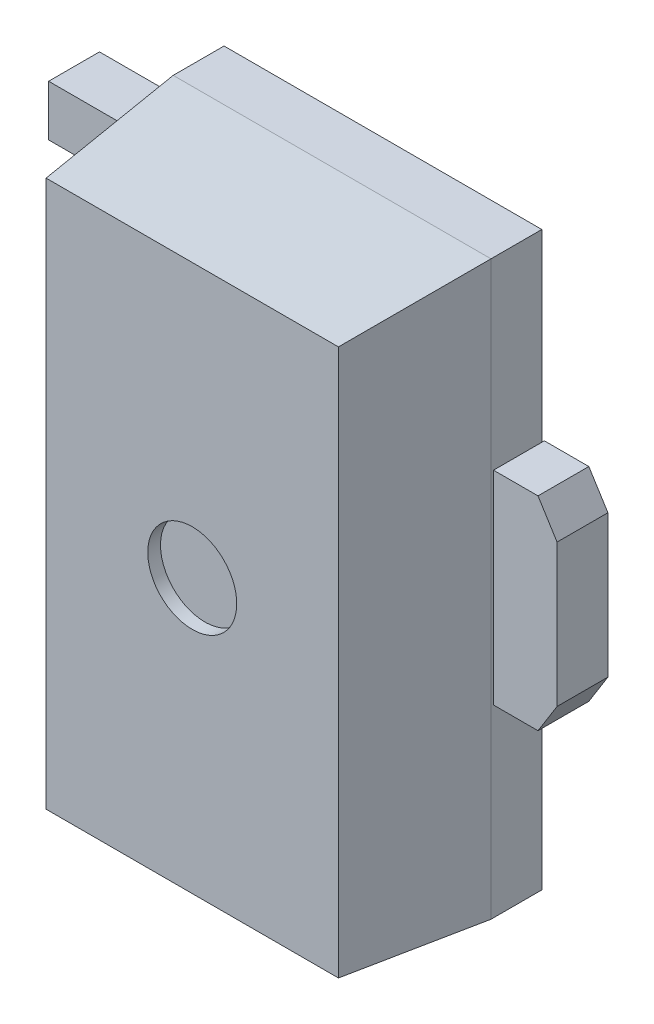
ISO-10303-21;
HEADER;
FILE_DESCRIPTION(('STEP AP214'),'2;1');
FILE_NAME('part.step','',(''),(''),'','','');
FILE_SCHEMA(('AUTOMOTIVE_DESIGN { 1 0 10303 214 1 1 1 1 }'));
ENDSEC;
DATA;
#1=APPLICATION_CONTEXT('core data for automotive mechanical design processes');
#2=APPLICATION_PROTOCOL_DEFINITION('international standard','automotive_design',2000,#1);
#3=PRODUCT_CONTEXT('',#1,'mechanical');
#4=PRODUCT('Part','Part','',(#3));
#5=PRODUCT_RELATED_PRODUCT_CATEGORY('part','',(#4));
#6=PRODUCT_DEFINITION_FORMATION('','',#4);
#7=PRODUCT_DEFINITION_CONTEXT('part definition',#1,'design');
#8=PRODUCT_DEFINITION('design','',#6,#7);
#9=PRODUCT_DEFINITION_SHAPE('','',#8);
#10=(LENGTH_UNIT() NAMED_UNIT(*) SI_UNIT(.MILLI.,.METRE.));
#11=(NAMED_UNIT(*) PLANE_ANGLE_UNIT() SI_UNIT($,.RADIAN.));
#12=(NAMED_UNIT(*) SI_UNIT($,.STERADIAN.) SOLID_ANGLE_UNIT());
#13=UNCERTAINTY_MEASURE_WITH_UNIT(LENGTH_MEASURE(1.E-05),#10,'distance_accuracy_value','');
#14=(GEOMETRIC_REPRESENTATION_CONTEXT(3) GLOBAL_UNCERTAINTY_ASSIGNED_CONTEXT((#13)) GLOBAL_UNIT_ASSIGNED_CONTEXT((#10,
#11,#12)) REPRESENTATION_CONTEXT('',''));
#15=CARTESIAN_POINT('',(0.,0.,0.));
#16=DIRECTION('',(0.,0.,1.));
#17=DIRECTION('',(1.,0.,0.));
#18=AXIS2_PLACEMENT_3D('',#15,#16,#17);
#19=CARTESIAN_POINT('',(-2.25,1.7,0.4));
#20=DIRECTION('',(0.,0.,1.));
#21=DIRECTION('',(1.,0.,0.));
#22=AXIS2_PLACEMENT_3D('',#19,#20,#21);
#23=PLANE('',#22);
#24=DIRECTION('',(0.,-1.,0.));
#25=VECTOR('',#24,1.);
#26=CARTESIAN_POINT('',(-2.25,1.7,0.4));
#27=LINE('',#26,#25);
#28=CARTESIAN_POINT('',(-2.25,1.7,0.4));
#29=VERTEX_POINT('',#28);
#30=CARTESIAN_POINT('',(-2.25,1.3,0.4));
#31=VERTEX_POINT('',#30);
#32=EDGE_CURVE('P0_E10',#29,#31,#27,.T.);
#33=ORIENTED_EDGE('',*,*,#32,.T.);
#34=DIRECTION('',(1.,0.,0.));
#35=VECTOR('',#34,1.);
#36=CARTESIAN_POINT('',(-2.25,1.3,0.4));
#37=LINE('',#36,#35);
#38=CARTESIAN_POINT('',(-0.75,1.3,0.4));
#39=VERTEX_POINT('',#38);
#40=EDGE_CURVE('P0_E27',#31,#39,#37,.T.);
#41=ORIENTED_EDGE('',*,*,#40,.T.);
#42=DIRECTION('',(0.,-1.,0.));
#43=VECTOR('',#42,1.);
#44=CARTESIAN_POINT('',(-0.75,1.7,0.4));
#45=LINE('',#44,#43);
#46=CARTESIAN_POINT('',(-0.75,1.7,0.4));
#47=VERTEX_POINT('',#46);
#48=EDGE_CURVE('P0_E94',#47,#39,#45,.T.);
#49=ORIENTED_EDGE('',*,*,#48,.F.);
#50=DIRECTION('',(1.,0.,0.));
#51=VECTOR('',#50,1.);
#52=CARTESIAN_POINT('',(-2.25,1.7,0.4));
#53=LINE('',#52,#51);
#54=EDGE_CURVE('P0_E52',#29,#47,#53,.T.);
#55=ORIENTED_EDGE('',*,*,#54,.F.);
#56=EDGE_LOOP('',(#33,#41,#49,#55));
#57=FACE_BOUND('',#56,.T.);
#58=ADVANCED_FACE('P0_F16',(#57),#23,.T.);
#59=CARTESIAN_POINT('',(-2.25,1.7,0.));
#60=DIRECTION('',(-1.,0.,0.));
#61=DIRECTION('',(0.,0.,1.));
#62=AXIS2_PLACEMENT_3D('',#59,#60,#61);
#63=PLANE('',#62);
#64=DIRECTION('',(0.,-1.,0.));
#65=VECTOR('',#64,1.);
#66=CARTESIAN_POINT('',(-2.25,1.7,0.));
#67=LINE('',#66,#65);
#68=CARTESIAN_POINT('',(-2.25,1.7,0.));
#69=VERTEX_POINT('',#68);
#70=CARTESIAN_POINT('',(-2.25,1.3,0.));
#71=VERTEX_POINT('',#70);
#72=EDGE_CURVE('P0_E106',#69,#71,#67,.T.);
#73=ORIENTED_EDGE('',*,*,#72,.T.);
#74=DIRECTION('',(0.,0.,1.));
#75=VECTOR('',#74,1.);
#76=CARTESIAN_POINT('',(-2.25,1.3,0.));
#77=LINE('',#76,#75);
#78=EDGE_CURVE('P0_E65',#71,#31,#77,.T.);
#79=ORIENTED_EDGE('',*,*,#78,.T.);
#80=ORIENTED_EDGE('',*,*,#32,.F.);
#81=DIRECTION('',(0.,0.,1.));
#82=VECTOR('',#81,1.);
#83=CARTESIAN_POINT('',(-2.25,1.7,0.));
#84=LINE('',#83,#82);
#85=EDGE_CURVE('P0_E91',#69,#29,#84,.T.);
#86=ORIENTED_EDGE('',*,*,#85,.F.);
#87=EDGE_LOOP('',(#73,#79,#80,#86));
#88=FACE_BOUND('',#87,.T.);
#89=ADVANCED_FACE('P0_F121',(#88),#63,.T.);
#90=CARTESIAN_POINT('',(-0.75,1.7,0.4));
#91=DIRECTION('',(1.,0.,0.));
#92=DIRECTION('',(0.,1.,0.));
#93=AXIS2_PLACEMENT_3D('',#90,#91,#92);
#94=PLANE('',#93);
#95=ORIENTED_EDGE('',*,*,#48,.T.);
#96=DIRECTION('',(0.,0.,-1.));
#97=VECTOR('',#96,1.);
#98=CARTESIAN_POINT('',(-0.75,1.3,0.4));
#99=LINE('',#98,#97);
#100=CARTESIAN_POINT('',(-0.75,1.3,0.));
#101=VERTEX_POINT('',#100);
#102=EDGE_CURVE('P0_E93',#39,#101,#99,.T.);
#103=ORIENTED_EDGE('',*,*,#102,.T.);
#104=DIRECTION('',(0.,-1.,0.));
#105=VECTOR('',#104,1.);
#106=CARTESIAN_POINT('',(-0.75,1.7,0.));
#107=LINE('',#106,#105);
#108=CARTESIAN_POINT('',(-0.75,1.7,0.));
#109=VERTEX_POINT('',#108);
#110=EDGE_CURVE('P0_E82',#109,#101,#107,.T.);
#111=ORIENTED_EDGE('',*,*,#110,.F.);
#112=DIRECTION('',(0.,0.,-1.));
#113=VECTOR('',#112,1.);
#114=CARTESIAN_POINT('',(-0.75,1.7,0.4));
#115=LINE('',#114,#113);
#116=EDGE_CURVE('P0_E113',#47,#109,#115,.T.);
#117=ORIENTED_EDGE('',*,*,#116,.F.);
#118=EDGE_LOOP('',(#95,#103,#111,#117));
#119=FACE_BOUND('',#118,.T.);
#120=ADVANCED_FACE('P0_F18',(#119),#94,.T.);
#121=CARTESIAN_POINT('',(-1.5,1.7,0.2));
#122=DIRECTION('',(0.,1.,0.));
#123=DIRECTION('',(1.,0.,0.));
#124=AXIS2_PLACEMENT_3D('',#121,#122,#123);
#125=PLANE('',#124);
#126=ORIENTED_EDGE('',*,*,#54,.T.);
#127=ORIENTED_EDGE('',*,*,#116,.T.);
#128=DIRECTION('',(-1.,0.,0.));
#129=VECTOR('',#128,1.);
#130=CARTESIAN_POINT('',(-0.75,1.7,0.));
#131=LINE('',#130,#129);
#132=EDGE_CURVE('P0_E20',#109,#69,#131,.T.);
#133=ORIENTED_EDGE('',*,*,#132,.T.);
#134=ORIENTED_EDGE('',*,*,#85,.T.);
#135=EDGE_LOOP('',(#126,#127,#133,#134));
#136=FACE_BOUND('',#135,.T.);
#137=ADVANCED_FACE('P0_F122',(#136),#125,.T.);
#138=CARTESIAN_POINT('',(-1.5,1.3,0.2));
#139=DIRECTION('',(0.,1.,0.));
#140=DIRECTION('',(1.,0.,0.));
#141=AXIS2_PLACEMENT_3D('',#138,#139,#140);
#142=PLANE('',#141);
#143=ORIENTED_EDGE('',*,*,#78,.F.);
#144=DIRECTION('',(-1.,0.,0.));
#145=VECTOR('',#144,1.);
#146=CARTESIAN_POINT('',(-0.75,1.3,0.));
#147=LINE('',#146,#145);
#148=EDGE_CURVE('P0_E86',#101,#71,#147,.T.);
#149=ORIENTED_EDGE('',*,*,#148,.F.);
#150=ORIENTED_EDGE('',*,*,#102,.F.);
#151=ORIENTED_EDGE('',*,*,#40,.F.);
#152=EDGE_LOOP('',(#143,#149,#150,#151));
#153=FACE_BOUND('',#152,.T.);
#154=ADVANCED_FACE('P0_F97',(#153),#142,.F.);
#155=CARTESIAN_POINT('',(-0.75,1.7,0.));
#156=DIRECTION('',(0.,0.,-1.));
#157=DIRECTION('',(-1.,0.,0.));
#158=AXIS2_PLACEMENT_3D('',#155,#156,#157);
#159=PLANE('',#158);
#160=ORIENTED_EDGE('',*,*,#110,.T.);
#161=ORIENTED_EDGE('',*,*,#148,.T.);
#162=ORIENTED_EDGE('',*,*,#72,.F.);
#163=ORIENTED_EDGE('',*,*,#132,.F.);
#164=EDGE_LOOP('',(#160,#161,#162,#163));
#165=FACE_BOUND('',#164,.T.);
#166=ADVANCED_FACE('P0_F84',(#165),#159,.T.);
#167=CLOSED_SHELL('',(#58,#89,#120,#137,#154,#166));
#168=MANIFOLD_SOLID_BREP('P0_B1',#167);
#169=CARTESIAN_POINT('',(-2.25,0.2,0.4));
#170=DIRECTION('',(0.,0.,1.));
#171=DIRECTION('',(1.,0.,0.));
#172=AXIS2_PLACEMENT_3D('',#169,#170,#171);
#173=PLANE('',#172);
#174=DIRECTION('',(0.,-1.,0.));
#175=VECTOR('',#174,1.);
#176=CARTESIAN_POINT('',(-2.25,0.2,0.4));
#177=LINE('',#176,#175);
#178=CARTESIAN_POINT('',(-2.25,0.2,0.4));
#179=VERTEX_POINT('',#178);
#180=CARTESIAN_POINT('',(-2.25,-0.2,0.4));
#181=VERTEX_POINT('',#180);
#182=EDGE_CURVE('P1_E11',#179,#181,#177,.T.);
#183=ORIENTED_EDGE('',*,*,#182,.T.);
#184=DIRECTION('',(1.,0.,0.));
#185=VECTOR('',#184,1.);
#186=CARTESIAN_POINT('',(-2.25,-0.2,0.4));
#187=LINE('',#186,#185);
#188=CARTESIAN_POINT('',(-0.75,-0.2,0.4));
#189=VERTEX_POINT('',#188);
#190=EDGE_CURVE('P1_E28',#181,#189,#187,.T.);
#191=ORIENTED_EDGE('',*,*,#190,.T.);
#192=DIRECTION('',(0.,-1.,0.));
#193=VECTOR('',#192,1.);
#194=CARTESIAN_POINT('',(-0.75,0.2,0.4));
#195=LINE('',#194,#193);
#196=CARTESIAN_POINT('',(-0.75,0.2,0.4));
#197=VERTEX_POINT('',#196);
#198=EDGE_CURVE('P1_E103',#197,#189,#195,.T.);
#199=ORIENTED_EDGE('',*,*,#198,.F.);
#200=DIRECTION('',(1.,0.,0.));
#201=VECTOR('',#200,1.);
#202=CARTESIAN_POINT('',(-2.25,0.2,0.4));
#203=LINE('',#202,#201);
#204=EDGE_CURVE('P1_E82',#179,#197,#203,.T.);
#205=ORIENTED_EDGE('',*,*,#204,.F.);
#206=EDGE_LOOP('',(#183,#191,#199,#205));
#207=FACE_BOUND('',#206,.T.);
#208=ADVANCED_FACE('P1_F17',(#207),#173,.T.);
#209=CARTESIAN_POINT('',(-0.75,0.2,0.4));
#210=DIRECTION('',(1.,0.,0.));
#211=DIRECTION('',(0.,1.,0.));
#212=AXIS2_PLACEMENT_3D('',#209,#210,#211);
#213=PLANE('',#212);
#214=ORIENTED_EDGE('',*,*,#198,.T.);
#215=DIRECTION('',(0.,0.,-1.));
#216=VECTOR('',#215,1.);
#217=CARTESIAN_POINT('',(-0.75,-0.2,0.4));
#218=LINE('',#217,#216);
#219=CARTESIAN_POINT('',(-0.75,-0.2,0.));
#220=VERTEX_POINT('',#219);
#221=EDGE_CURVE('P1_E88',#189,#220,#218,.T.);
#222=ORIENTED_EDGE('',*,*,#221,.T.);
#223=DIRECTION('',(0.,-1.,0.));
#224=VECTOR('',#223,1.);
#225=CARTESIAN_POINT('',(-0.75,0.2,0.));
#226=LINE('',#225,#224);
#227=CARTESIAN_POINT('',(-0.75,0.2,0.));
#228=VERTEX_POINT('',#227);
#229=EDGE_CURVE('P1_E21',#228,#220,#226,.T.);
#230=ORIENTED_EDGE('',*,*,#229,.F.);
#231=DIRECTION('',(0.,0.,-1.));
#232=VECTOR('',#231,1.);
#233=CARTESIAN_POINT('',(-0.75,0.2,0.4));
#234=LINE('',#233,#232);
#235=EDGE_CURVE('P1_E76',#197,#228,#234,.T.);
#236=ORIENTED_EDGE('',*,*,#235,.F.);
#237=EDGE_LOOP('',(#214,#222,#230,#236));
#238=FACE_BOUND('',#237,.T.);
#239=ADVANCED_FACE('P1_F87',(#238),#213,.T.);
#240=CARTESIAN_POINT('',(-0.75,0.2,0.));
#241=DIRECTION('',(0.,0.,-1.));
#242=DIRECTION('',(-1.,0.,0.));
#243=AXIS2_PLACEMENT_3D('',#240,#241,#242);
#244=PLANE('',#243);
#245=ORIENTED_EDGE('',*,*,#229,.T.);
#246=DIRECTION('',(-1.,0.,0.));
#247=VECTOR('',#246,1.);
#248=CARTESIAN_POINT('',(-0.75,-0.2,0.));
#249=LINE('',#248,#247);
#250=CARTESIAN_POINT('',(-2.25,-0.2,0.));
#251=VERTEX_POINT('',#250);
#252=EDGE_CURVE('P1_E92',#220,#251,#249,.T.);
#253=ORIENTED_EDGE('',*,*,#252,.T.);
#254=DIRECTION('',(0.,-1.,0.));
#255=VECTOR('',#254,1.);
#256=CARTESIAN_POINT('',(-2.25,0.2,0.));
#257=LINE('',#256,#255);
#258=CARTESIAN_POINT('',(-2.25,0.2,0.));
#259=VERTEX_POINT('',#258);
#260=EDGE_CURVE('P1_E69',#259,#251,#257,.T.);
#261=ORIENTED_EDGE('',*,*,#260,.F.);
#262=DIRECTION('',(-1.,0.,0.));
#263=VECTOR('',#262,1.);
#264=CARTESIAN_POINT('',(-0.75,0.2,0.));
#265=LINE('',#264,#263);
#266=EDGE_CURVE('P1_E81',#228,#259,#265,.T.);
#267=ORIENTED_EDGE('',*,*,#266,.F.);
#268=EDGE_LOOP('',(#245,#253,#261,#267));
#269=FACE_BOUND('',#268,.T.);
#270=ADVANCED_FACE('P1_F19',(#269),#244,.T.);
#271=CARTESIAN_POINT('',(-2.25,0.2,0.));
#272=DIRECTION('',(-1.,0.,0.));
#273=DIRECTION('',(0.,0.,1.));
#274=AXIS2_PLACEMENT_3D('',#271,#272,#273);
#275=PLANE('',#274);
#276=ORIENTED_EDGE('',*,*,#260,.T.);
#277=DIRECTION('',(0.,0.,1.));
#278=VECTOR('',#277,1.);
#279=CARTESIAN_POINT('',(-2.25,-0.2,0.));
#280=LINE('',#279,#278);
#281=EDGE_CURVE('P1_E107',#251,#181,#280,.T.);
#282=ORIENTED_EDGE('',*,*,#281,.T.);
#283=ORIENTED_EDGE('',*,*,#182,.F.);
#284=DIRECTION('',(0.,0.,1.));
#285=VECTOR('',#284,1.);
#286=CARTESIAN_POINT('',(-2.25,0.2,0.));
#287=LINE('',#286,#285);
#288=EDGE_CURVE('P1_E94',#259,#179,#287,.T.);
#289=ORIENTED_EDGE('',*,*,#288,.F.);
#290=EDGE_LOOP('',(#276,#282,#283,#289));
#291=FACE_BOUND('',#290,.T.);
#292=ADVANCED_FACE('P1_F120',(#291),#275,.T.);
#293=CARTESIAN_POINT('',(-1.5,0.2,0.2));
#294=DIRECTION('',(0.,1.,0.));
#295=DIRECTION('',(1.,0.,0.));
#296=AXIS2_PLACEMENT_3D('',#293,#294,#295);
#297=PLANE('',#296);
#298=ORIENTED_EDGE('',*,*,#204,.T.);
#299=ORIENTED_EDGE('',*,*,#235,.T.);
#300=ORIENTED_EDGE('',*,*,#266,.T.);
#301=ORIENTED_EDGE('',*,*,#288,.T.);
#302=EDGE_LOOP('',(#298,#299,#300,#301));
#303=FACE_BOUND('',#302,.T.);
#304=ADVANCED_FACE('P1_F78',(#303),#297,.T.);
#305=CARTESIAN_POINT('',(-1.5,-0.2,0.2));
#306=DIRECTION('',(0.,1.,0.));
#307=DIRECTION('',(1.,0.,0.));
#308=AXIS2_PLACEMENT_3D('',#305,#306,#307);
#309=PLANE('',#308);
#310=ORIENTED_EDGE('',*,*,#281,.F.);
#311=ORIENTED_EDGE('',*,*,#252,.F.);
#312=ORIENTED_EDGE('',*,*,#221,.F.);
#313=ORIENTED_EDGE('',*,*,#190,.F.);
#314=EDGE_LOOP('',(#310,#311,#312,#313));
#315=FACE_BOUND('',#314,.T.);
#316=ADVANCED_FACE('P1_F128',(#315),#309,.F.);
#317=CLOSED_SHELL('',(#208,#239,#270,#292,#304,#316));
#318=MANIFOLD_SOLID_BREP('P1_B1',#317);
#319=CARTESIAN_POINT('',(-2.25,-1.3,0.4));
#320=DIRECTION('',(0.,0.,1.));
#321=DIRECTION('',(1.,0.,0.));
#322=AXIS2_PLACEMENT_3D('',#319,#320,#321);
#323=PLANE('',#322);
#324=DIRECTION('',(0.,-1.,0.));
#325=VECTOR('',#324,1.);
#326=CARTESIAN_POINT('',(-2.25,-1.3,0.4));
#327=LINE('',#326,#325);
#328=CARTESIAN_POINT('',(-2.25,-1.3,0.4));
#329=VERTEX_POINT('',#328);
#330=CARTESIAN_POINT('',(-2.25,-1.7,0.4));
#331=VERTEX_POINT('',#330);
#332=EDGE_CURVE('P2_E11',#329,#331,#327,.T.);
#333=ORIENTED_EDGE('',*,*,#332,.T.);
#334=DIRECTION('',(1.,0.,0.));
#335=VECTOR('',#334,1.);
#336=CARTESIAN_POINT('',(-2.25,-1.7,0.4));
#337=LINE('',#336,#335);
#338=CARTESIAN_POINT('',(-0.75,-1.7,0.4));
#339=VERTEX_POINT('',#338);
#340=EDGE_CURVE('P2_E28',#331,#339,#337,.T.);
#341=ORIENTED_EDGE('',*,*,#340,.T.);
#342=DIRECTION('',(0.,-1.,0.));
#343=VECTOR('',#342,1.);
#344=CARTESIAN_POINT('',(-0.75,-1.3,0.4));
#345=LINE('',#344,#343);
#346=CARTESIAN_POINT('',(-0.75,-1.3,0.4));
#347=VERTEX_POINT('',#346);
#348=EDGE_CURVE('P2_E88',#347,#339,#345,.T.);
#349=ORIENTED_EDGE('',*,*,#348,.F.);
#350=DIRECTION('',(1.,0.,0.));
#351=VECTOR('',#350,1.);
#352=CARTESIAN_POINT('',(-2.25,-1.3,0.4));
#353=LINE('',#352,#351);
#354=EDGE_CURVE('P2_E104',#329,#347,#353,.T.);
#355=ORIENTED_EDGE('',*,*,#354,.F.);
#356=EDGE_LOOP('',(#333,#341,#349,#355));
#357=FACE_BOUND('',#356,.T.);
#358=ADVANCED_FACE('P2_F17',(#357),#323,.T.);
#359=CARTESIAN_POINT('',(-0.75,-1.3,0.4));
#360=DIRECTION('',(1.,0.,0.));
#361=DIRECTION('',(0.,1.,0.));
#362=AXIS2_PLACEMENT_3D('',#359,#360,#361);
#363=PLANE('',#362);
#364=ORIENTED_EDGE('',*,*,#348,.T.);
#365=DIRECTION('',(0.,0.,-1.));
#366=VECTOR('',#365,1.);
#367=CARTESIAN_POINT('',(-0.75,-1.7,0.4));
#368=LINE('',#367,#366);
#369=CARTESIAN_POINT('',(-0.75,-1.7,0.));
#370=VERTEX_POINT('',#369);
#371=EDGE_CURVE('P2_E84',#339,#370,#368,.T.);
#372=ORIENTED_EDGE('',*,*,#371,.T.);
#373=DIRECTION('',(0.,-1.,0.));
#374=VECTOR('',#373,1.);
#375=CARTESIAN_POINT('',(-0.75,-1.3,0.));
#376=LINE('',#375,#374);
#377=CARTESIAN_POINT('',(-0.75,-1.3,0.));
#378=VERTEX_POINT('',#377);
#379=EDGE_CURVE('P2_E75',#378,#370,#376,.T.);
#380=ORIENTED_EDGE('',*,*,#379,.F.);
#381=DIRECTION('',(0.,0.,-1.));
#382=VECTOR('',#381,1.);
#383=CARTESIAN_POINT('',(-0.75,-1.3,0.4));
#384=LINE('',#383,#382);
#385=EDGE_CURVE('P2_E67',#347,#378,#384,.T.);
#386=ORIENTED_EDGE('',*,*,#385,.F.);
#387=EDGE_LOOP('',(#364,#372,#380,#386));
#388=FACE_BOUND('',#387,.T.);
#389=ADVANCED_FACE('P2_F86',(#388),#363,.T.);
#390=CARTESIAN_POINT('',(-0.75,-1.3,0.));
#391=DIRECTION('',(0.,0.,-1.));
#392=DIRECTION('',(-1.,0.,0.));
#393=AXIS2_PLACEMENT_3D('',#390,#391,#392);
#394=PLANE('',#393);
#395=ORIENTED_EDGE('',*,*,#379,.T.);
#396=DIRECTION('',(-1.,0.,0.));
#397=VECTOR('',#396,1.);
#398=CARTESIAN_POINT('',(-0.75,-1.7,0.));
#399=LINE('',#398,#397);
#400=CARTESIAN_POINT('',(-2.25,-1.7,0.));
#401=VERTEX_POINT('',#400);
#402=EDGE_CURVE('P2_E80',#370,#401,#399,.T.);
#403=ORIENTED_EDGE('',*,*,#402,.T.);
#404=DIRECTION('',(0.,-1.,0.));
#405=VECTOR('',#404,1.);
#406=CARTESIAN_POINT('',(-2.25,-1.3,0.));
#407=LINE('',#406,#405);
#408=CARTESIAN_POINT('',(-2.25,-1.3,0.));
#409=VERTEX_POINT('',#408);
#410=EDGE_CURVE('P2_E94',#409,#401,#407,.T.);
#411=ORIENTED_EDGE('',*,*,#410,.F.);
#412=DIRECTION('',(-1.,0.,0.));
#413=VECTOR('',#412,1.);
#414=CARTESIAN_POINT('',(-0.75,-1.3,0.));
#415=LINE('',#414,#413);
#416=EDGE_CURVE('P2_E81',#378,#409,#415,.T.);
#417=ORIENTED_EDGE('',*,*,#416,.F.);
#418=EDGE_LOOP('',(#395,#403,#411,#417));
#419=FACE_BOUND('',#418,.T.);
#420=ADVANCED_FACE('P2_F77',(#419),#394,.T.);
#421=CARTESIAN_POINT('',(-2.25,-1.3,0.));
#422=DIRECTION('',(-1.,0.,0.));
#423=DIRECTION('',(0.,0.,1.));
#424=AXIS2_PLACEMENT_3D('',#421,#422,#423);
#425=PLANE('',#424);
#426=ORIENTED_EDGE('',*,*,#410,.T.);
#427=DIRECTION('',(0.,0.,1.));
#428=VECTOR('',#427,1.);
#429=CARTESIAN_POINT('',(-2.25,-1.7,0.));
#430=LINE('',#429,#428);
#431=EDGE_CURVE('P2_E21',#401,#331,#430,.T.);
#432=ORIENTED_EDGE('',*,*,#431,.T.);
#433=ORIENTED_EDGE('',*,*,#332,.F.);
#434=DIRECTION('',(0.,0.,1.));
#435=VECTOR('',#434,1.);
#436=CARTESIAN_POINT('',(-2.25,-1.3,0.));
#437=LINE('',#436,#435);
#438=EDGE_CURVE('P2_E106',#409,#329,#437,.T.);
#439=ORIENTED_EDGE('',*,*,#438,.F.);
#440=EDGE_LOOP('',(#426,#432,#433,#439));
#441=FACE_BOUND('',#440,.T.);
#442=ADVANCED_FACE('P2_F19',(#441),#425,.T.);
#443=CARTESIAN_POINT('',(-1.5,-1.3,0.2));
#444=DIRECTION('',(0.,1.,0.));
#445=DIRECTION('',(1.,0.,0.));
#446=AXIS2_PLACEMENT_3D('',#443,#444,#445);
#447=PLANE('',#446);
#448=ORIENTED_EDGE('',*,*,#354,.T.);
#449=ORIENTED_EDGE('',*,*,#385,.T.);
#450=ORIENTED_EDGE('',*,*,#416,.T.);
#451=ORIENTED_EDGE('',*,*,#438,.T.);
#452=EDGE_LOOP('',(#448,#449,#450,#451));
#453=FACE_BOUND('',#452,.T.);
#454=ADVANCED_FACE('P2_F158',(#453),#447,.T.);
#455=CARTESIAN_POINT('',(-1.5,-1.7,0.2));
#456=DIRECTION('',(0.,1.,0.));
#457=DIRECTION('',(1.,0.,0.));
#458=AXIS2_PLACEMENT_3D('',#455,#456,#457);
#459=PLANE('',#458);
#460=ORIENTED_EDGE('',*,*,#431,.F.);
#461=ORIENTED_EDGE('',*,*,#402,.F.);
#462=ORIENTED_EDGE('',*,*,#371,.F.);
#463=ORIENTED_EDGE('',*,*,#340,.F.);
#464=EDGE_LOOP('',(#460,#461,#462,#463));
#465=FACE_BOUND('',#464,.T.);
#466=ADVANCED_FACE('P2_F91',(#465),#459,.F.);
#467=CLOSED_SHELL('',(#358,#389,#420,#442,#454,#466));
#468=MANIFOLD_SOLID_BREP('P2_B1',#467);
#469=CARTESIAN_POINT('',(1.75,0.,0.));
#470=DIRECTION('',(1.,0.,0.));
#471=DIRECTION('',(0.,1.,0.));
#472=AXIS2_PLACEMENT_3D('',#469,#470,#471);
#473=PLANE('',#472);
#474=DIRECTION('',(0.,0.,1.));
#475=VECTOR('',#474,1.);
#476=CARTESIAN_POINT('',(1.75,-0.56,0.));
#477=LINE('',#476,#475);
#478=CARTESIAN_POINT('',(1.75,-0.56,0.));
#479=VERTEX_POINT('',#478);
#480=CARTESIAN_POINT('',(1.75,-0.56,0.4));
#481=VERTEX_POINT('',#480);
#482=EDGE_CURVE('P3_E37',#479,#481,#477,.T.);
#483=ORIENTED_EDGE('',*,*,#482,.F.);
#484=DIRECTION('',(0.,1.,0.));
#485=VECTOR('',#484,1.);
#486=CARTESIAN_POINT('',(1.75,-0.56,0.));
#487=LINE('',#486,#485);
#488=CARTESIAN_POINT('',(1.75,0.56,0.));
#489=VERTEX_POINT('',#488);
#490=EDGE_CURVE('P3_E11',#479,#489,#487,.T.);
#491=ORIENTED_EDGE('',*,*,#490,.T.);
#492=DIRECTION('',(0.,0.,1.));
#493=VECTOR('',#492,1.);
#494=CARTESIAN_POINT('',(1.75,0.56,0.));
#495=LINE('',#494,#493);
#496=CARTESIAN_POINT('',(1.75,0.56,0.4));
#497=VERTEX_POINT('',#496);
#498=EDGE_CURVE('P3_E26',#489,#497,#495,.T.);
#499=ORIENTED_EDGE('',*,*,#498,.T.);
#500=DIRECTION('',(0.,-1.,0.));
#501=VECTOR('',#500,1.);
#502=CARTESIAN_POINT('',(1.75,0.56,0.4));
#503=LINE('',#502,#501);
#504=EDGE_CURVE('P3_E146',#497,#481,#503,.T.);
#505=ORIENTED_EDGE('',*,*,#504,.T.);
#506=EDGE_LOOP('',(#483,#491,#499,#505));
#507=FACE_BOUND('',#506,.T.);
#508=ADVANCED_FACE('P3_F17',(#507),#473,.T.);
#509=CARTESIAN_POINT('',(1.75,-0.56,0.));
#510=DIRECTION('',(0.847998304005144,-0.52999894000309,0.));
#511=DIRECTION('',(0.,0.,-1.));
#512=AXIS2_PLACEMENT_3D('',#509,#510,#511);
#513=PLANE('',#512);
#514=ORIENTED_EDGE('',*,*,#482,.T.);
#515=DIRECTION('',(-0.52999894000309,-0.847998304005144,0.));
#516=VECTOR('',#515,1.);
#517=CARTESIAN_POINT('',(1.75,-0.56,0.4));
#518=LINE('',#517,#516);
#519=CARTESIAN_POINT('',(1.6,-0.8,0.4));
#520=VERTEX_POINT('',#519);
#521=EDGE_CURVE('P3_E143',#481,#520,#518,.T.);
#522=ORIENTED_EDGE('',*,*,#521,.T.);
#523=DIRECTION('',(0.,0.,1.));
#524=VECTOR('',#523,1.);
#525=CARTESIAN_POINT('',(1.6,-0.8,0.));
#526=LINE('',#525,#524);
#527=CARTESIAN_POINT('',(1.6,-0.8,0.));
#528=VERTEX_POINT('',#527);
#529=EDGE_CURVE('P3_E136',#528,#520,#526,.T.);
#530=ORIENTED_EDGE('',*,*,#529,.F.);
#531=DIRECTION('',(-0.52999894000309,-0.847998304005144,0.));
#532=VECTOR('',#531,1.);
#533=CARTESIAN_POINT('',(1.75,-0.56,0.));
#534=LINE('',#533,#532);
#535=EDGE_CURVE('P3_E129',#479,#528,#534,.T.);
#536=ORIENTED_EDGE('',*,*,#535,.F.);
#537=EDGE_LOOP('',(#514,#522,#530,#536));
#538=FACE_BOUND('',#537,.T.);
#539=ADVANCED_FACE('P3_F141',(#538),#513,.T.);
#540=CARTESIAN_POINT('',(1.6,-0.8,0.));
#541=DIRECTION('',(0.,-1.,0.));
#542=DIRECTION('',(0.,0.,-1.));
#543=AXIS2_PLACEMENT_3D('',#540,#541,#542);
#544=PLANE('',#543);
#545=ORIENTED_EDGE('',*,*,#529,.T.);
#546=DIRECTION('',(-1.,0.,0.));
#547=VECTOR('',#546,1.);
#548=CARTESIAN_POINT('',(1.6,-0.8,0.4));
#549=LINE('',#548,#547);
#550=CARTESIAN_POINT('',(1.25,-0.8,0.4));
#551=VERTEX_POINT('',#550);
#552=EDGE_CURVE('P3_E154',#520,#551,#549,.T.);
#553=ORIENTED_EDGE('',*,*,#552,.T.);
#554=DIRECTION('',(0.,0.,1.));
#555=VECTOR('',#554,1.);
#556=CARTESIAN_POINT('',(1.25,-0.8,0.));
#557=LINE('',#556,#555);
#558=CARTESIAN_POINT('',(1.25,-0.8,0.));
#559=VERTEX_POINT('',#558);
#560=EDGE_CURVE('P3_E203',#559,#551,#557,.T.);
#561=ORIENTED_EDGE('',*,*,#560,.F.);
#562=DIRECTION('',(-1.,0.,0.));
#563=VECTOR('',#562,1.);
#564=CARTESIAN_POINT('',(1.6,-0.8,0.));
#565=LINE('',#564,#563);
#566=EDGE_CURVE('P3_E178',#528,#559,#565,.T.);
#567=ORIENTED_EDGE('',*,*,#566,.F.);
#568=EDGE_LOOP('',(#545,#553,#561,#567));
#569=FACE_BOUND('',#568,.T.);
#570=ADVANCED_FACE('P3_F362',(#569),#544,.T.);
#571=CARTESIAN_POINT('',(1.25,-0.8,0.));
#572=DIRECTION('',(-1.,0.,0.));
#573=DIRECTION('',(0.,0.,1.));
#574=AXIS2_PLACEMENT_3D('',#571,#572,#573);
#575=PLANE('',#574);
#576=ORIENTED_EDGE('',*,*,#560,.T.);
#577=DIRECTION('',(0.,1.,0.));
#578=VECTOR('',#577,1.);
#579=CARTESIAN_POINT('',(1.25,-0.8,0.4));
#580=LINE('',#579,#578);
#581=CARTESIAN_POINT('',(1.25,-0.64,0.4));
#582=VERTEX_POINT('',#581);
#583=EDGE_CURVE('P3_E205',#551,#582,#580,.T.);
#584=ORIENTED_EDGE('',*,*,#583,.T.);
#585=DIRECTION('',(0.,0.,1.));
#586=VECTOR('',#585,1.);
#587=CARTESIAN_POINT('',(1.25,-0.64,0.));
#588=LINE('',#587,#586);
#589=CARTESIAN_POINT('',(1.25,-0.64,0.));
#590=VERTEX_POINT('',#589);
#591=EDGE_CURVE('P3_E174',#590,#582,#588,.T.);
#592=ORIENTED_EDGE('',*,*,#591,.F.);
#593=DIRECTION('',(0.,1.,0.));
#594=VECTOR('',#593,1.);
#595=CARTESIAN_POINT('',(1.25,-0.8,0.));
#596=LINE('',#595,#594);
#597=EDGE_CURVE('P3_E221',#559,#590,#596,.T.);
#598=ORIENTED_EDGE('',*,*,#597,.F.);
#599=EDGE_LOOP('',(#576,#584,#592,#598));
#600=FACE_BOUND('',#599,.T.);
#601=ADVANCED_FACE('P3_F367',(#600),#575,.T.);
#602=CARTESIAN_POINT('',(1.25,-0.64,0.));
#603=DIRECTION('',(0.,-1.,0.));
#604=DIRECTION('',(0.,0.,-1.));
#605=AXIS2_PLACEMENT_3D('',#602,#603,#604);
#606=PLANE('',#605);
#607=ORIENTED_EDGE('',*,*,#591,.T.);
#608=DIRECTION('',(-1.,0.,0.));
#609=VECTOR('',#608,1.);
#610=CARTESIAN_POINT('',(1.25,-0.64,0.4));
#611=LINE('',#610,#609);
#612=CARTESIAN_POINT('',(-0.75,-0.64,0.4));
#613=VERTEX_POINT('',#612);
#614=EDGE_CURVE('P3_E170',#582,#613,#611,.T.);
#615=ORIENTED_EDGE('',*,*,#614,.T.);
#616=DIRECTION('',(0.,0.,1.));
#617=VECTOR('',#616,1.);
#618=CARTESIAN_POINT('',(-0.75,-0.64,0.));
#619=LINE('',#618,#617);
#620=CARTESIAN_POINT('',(-0.75,-0.64,0.));
#621=VERTEX_POINT('',#620);
#622=EDGE_CURVE('P3_E168',#621,#613,#619,.T.);
#623=ORIENTED_EDGE('',*,*,#622,.F.);
#624=DIRECTION('',(-1.,0.,0.));
#625=VECTOR('',#624,1.);
#626=CARTESIAN_POINT('',(1.25,-0.64,0.));
#627=LINE('',#626,#625);
#628=EDGE_CURVE('P3_E211',#590,#621,#627,.T.);
#629=ORIENTED_EDGE('',*,*,#628,.F.);
#630=EDGE_LOOP('',(#607,#615,#623,#629));
#631=FACE_BOUND('',#630,.T.);
#632=ADVANCED_FACE('P3_F365',(#631),#606,.T.);
#633=CARTESIAN_POINT('',(-0.75,-0.64,0.));
#634=DIRECTION('',(-1.,0.,0.));
#635=DIRECTION('',(0.,0.,1.));
#636=AXIS2_PLACEMENT_3D('',#633,#634,#635);
#637=PLANE('',#636);
#638=ORIENTED_EDGE('',*,*,#622,.T.);
#639=DIRECTION('',(0.,1.,0.));
#640=VECTOR('',#639,1.);
#641=CARTESIAN_POINT('',(-0.75,-0.64,0.4));
#642=LINE('',#641,#640);
#643=CARTESIAN_POINT('',(-0.75,0.64,0.4));
#644=VERTEX_POINT('',#643);
#645=EDGE_CURVE('P3_E164',#613,#644,#642,.T.);
#646=ORIENTED_EDGE('',*,*,#645,.T.);
#647=DIRECTION('',(0.,0.,1.));
#648=VECTOR('',#647,1.);
#649=CARTESIAN_POINT('',(-0.75,0.64,0.));
#650=LINE('',#649,#648);
#651=CARTESIAN_POINT('',(-0.75,0.64,0.));
#652=VERTEX_POINT('',#651);
#653=EDGE_CURVE('P3_E169',#652,#644,#650,.T.);
#654=ORIENTED_EDGE('',*,*,#653,.F.);
#655=DIRECTION('',(0.,1.,0.));
#656=VECTOR('',#655,1.);
#657=CARTESIAN_POINT('',(-0.75,-0.64,0.));
#658=LINE('',#657,#656);
#659=EDGE_CURVE('P3_E120',#621,#652,#658,.T.);
#660=ORIENTED_EDGE('',*,*,#659,.F.);
#661=EDGE_LOOP('',(#638,#646,#654,#660));
#662=FACE_BOUND('',#661,.T.);
#663=ADVANCED_FACE('P3_F19',(#662),#637,.T.);
#664=CARTESIAN_POINT('',(-0.75,0.64,0.));
#665=DIRECTION('',(0.,1.,0.));
#666=DIRECTION('',(1.,0.,0.));
#667=AXIS2_PLACEMENT_3D('',#664,#665,#666);
#668=PLANE('',#667);
#669=ORIENTED_EDGE('',*,*,#653,.T.);
#670=DIRECTION('',(1.,0.,0.));
#671=VECTOR('',#670,1.);
#672=CARTESIAN_POINT('',(-0.75,0.64,0.4));
#673=LINE('',#672,#671);
#674=CARTESIAN_POINT('',(1.25,0.64,0.4));
#675=VERTEX_POINT('',#674);
#676=EDGE_CURVE('P3_E190',#644,#675,#673,.T.);
#677=ORIENTED_EDGE('',*,*,#676,.T.);
#678=DIRECTION('',(0.,0.,1.));
#679=VECTOR('',#678,1.);
#680=CARTESIAN_POINT('',(1.25,0.64,0.));
#681=LINE('',#680,#679);
#682=CARTESIAN_POINT('',(1.25,0.64,0.));
#683=VERTEX_POINT('',#682);
#684=EDGE_CURVE('P3_E110',#683,#675,#681,.T.);
#685=ORIENTED_EDGE('',*,*,#684,.F.);
#686=DIRECTION('',(1.,0.,0.));
#687=VECTOR('',#686,1.);
#688=CARTESIAN_POINT('',(-0.75,0.64,0.));
#689=LINE('',#688,#687);
#690=EDGE_CURVE('P3_E192',#652,#683,#689,.T.);
#691=ORIENTED_EDGE('',*,*,#690,.F.);
#692=EDGE_LOOP('',(#669,#677,#685,#691));
#693=FACE_BOUND('',#692,.T.);
#694=ADVANCED_FACE('P3_F331',(#693),#668,.T.);
#695=CARTESIAN_POINT('',(1.25,0.64,0.));
#696=DIRECTION('',(-1.,0.,0.));
#697=DIRECTION('',(0.,0.,1.));
#698=AXIS2_PLACEMENT_3D('',#695,#696,#697);
#699=PLANE('',#698);
#700=ORIENTED_EDGE('',*,*,#684,.T.);
#701=DIRECTION('',(0.,1.,0.));
#702=VECTOR('',#701,1.);
#703=CARTESIAN_POINT('',(1.25,0.64,0.4));
#704=LINE('',#703,#702);
#705=CARTESIAN_POINT('',(1.25,0.8,0.4));
#706=VERTEX_POINT('',#705);
#707=EDGE_CURVE('P3_E191',#675,#706,#704,.T.);
#708=ORIENTED_EDGE('',*,*,#707,.T.);
#709=DIRECTION('',(0.,0.,1.));
#710=VECTOR('',#709,1.);
#711=CARTESIAN_POINT('',(1.25,0.8,0.));
#712=LINE('',#711,#710);
#713=CARTESIAN_POINT('',(1.25,0.8,0.));
#714=VERTEX_POINT('',#713);
#715=EDGE_CURVE('P3_E200',#714,#706,#712,.T.);
#716=ORIENTED_EDGE('',*,*,#715,.F.);
#717=DIRECTION('',(0.,1.,0.));
#718=VECTOR('',#717,1.);
#719=CARTESIAN_POINT('',(1.25,0.64,0.));
#720=LINE('',#719,#718);
#721=EDGE_CURVE('P3_E186',#683,#714,#720,.T.);
#722=ORIENTED_EDGE('',*,*,#721,.F.);
#723=EDGE_LOOP('',(#700,#708,#716,#722));
#724=FACE_BOUND('',#723,.T.);
#725=ADVANCED_FACE('P3_F341',(#724),#699,.T.);
#726=CARTESIAN_POINT('',(1.25,0.8,0.));
#727=DIRECTION('',(0.,1.,0.));
#728=DIRECTION('',(1.,0.,0.));
#729=AXIS2_PLACEMENT_3D('',#726,#727,#728);
#730=PLANE('',#729);
#731=ORIENTED_EDGE('',*,*,#715,.T.);
#732=DIRECTION('',(1.,0.,0.));
#733=VECTOR('',#732,1.);
#734=CARTESIAN_POINT('',(1.25,0.8,0.4));
#735=LINE('',#734,#733);
#736=CARTESIAN_POINT('',(1.6,0.8,0.4));
#737=VERTEX_POINT('',#736);
#738=EDGE_CURVE('P3_E182',#706,#737,#735,.T.);
#739=ORIENTED_EDGE('',*,*,#738,.T.);
#740=DIRECTION('',(0.,0.,1.));
#741=VECTOR('',#740,1.);
#742=CARTESIAN_POINT('',(1.6,0.8,0.));
#743=LINE('',#742,#741);
#744=CARTESIAN_POINT('',(1.6,0.8,0.));
#745=VERTEX_POINT('',#744);
#746=EDGE_CURVE('P3_E179',#745,#737,#743,.T.);
#747=ORIENTED_EDGE('',*,*,#746,.F.);
#748=DIRECTION('',(1.,0.,0.));
#749=VECTOR('',#748,1.);
#750=CARTESIAN_POINT('',(1.25,0.8,0.));
#751=LINE('',#750,#749);
#752=EDGE_CURVE('P3_E183',#714,#745,#751,.T.);
#753=ORIENTED_EDGE('',*,*,#752,.F.);
#754=EDGE_LOOP('',(#731,#739,#747,#753));
#755=FACE_BOUND('',#754,.T.);
#756=ADVANCED_FACE('P3_F339',(#755),#730,.T.);
#757=CARTESIAN_POINT('',(1.6,0.8,0.));
#758=DIRECTION('',(0.847998304005144,0.52999894000309,0.));
#759=DIRECTION('',(0.,0.,-1.));
#760=AXIS2_PLACEMENT_3D('',#757,#758,#759);
#761=PLANE('',#760);
#762=ORIENTED_EDGE('',*,*,#746,.T.);
#763=DIRECTION('',(0.52999894000309,-0.847998304005144,0.));
#764=VECTOR('',#763,1.);
#765=CARTESIAN_POINT('',(1.6,0.8,0.4));
#766=LINE('',#765,#764);
#767=EDGE_CURVE('P3_E177',#737,#497,#766,.T.);
#768=ORIENTED_EDGE('',*,*,#767,.T.);
#769=ORIENTED_EDGE('',*,*,#498,.F.);
#770=DIRECTION('',(0.52999894000309,-0.847998304005144,0.));
#771=VECTOR('',#770,1.);
#772=CARTESIAN_POINT('',(1.6,0.8,0.));
#773=LINE('',#772,#771);
#774=EDGE_CURVE('P3_E187',#745,#489,#773,.T.);
#775=ORIENTED_EDGE('',*,*,#774,.F.);
#776=EDGE_LOOP('',(#762,#768,#769,#775));
#777=FACE_BOUND('',#776,.T.);
#778=ADVANCED_FACE('P3_F343',(#777),#761,.T.);
#779=CARTESIAN_POINT('',(0.544151509358,0.,0.));
#780=DIRECTION('',(0.,0.,-1.));
#781=DIRECTION('',(0.,-1.,0.));
#782=AXIS2_PLACEMENT_3D('',#779,#780,#781);
#783=PLANE('',#782);
#784=ORIENTED_EDGE('',*,*,#490,.F.);
#785=ORIENTED_EDGE('',*,*,#535,.T.);
#786=ORIENTED_EDGE('',*,*,#566,.T.);
#787=ORIENTED_EDGE('',*,*,#597,.T.);
#788=ORIENTED_EDGE('',*,*,#628,.T.);
#789=ORIENTED_EDGE('',*,*,#659,.T.);
#790=ORIENTED_EDGE('',*,*,#690,.T.);
#791=ORIENTED_EDGE('',*,*,#721,.T.);
#792=ORIENTED_EDGE('',*,*,#752,.T.);
#793=ORIENTED_EDGE('',*,*,#774,.T.);
#794=EDGE_LOOP('',(#784,#785,#786,#787,#788,#789,#790,#791,#792,#793));
#795=FACE_BOUND('',#794,.T.);
#796=ADVANCED_FACE('P3_F342',(#795),#783,.T.);
#797=CARTESIAN_POINT('',(0.544151509358,0.,0.4));
#798=DIRECTION('',(0.,0.,-1.));
#799=DIRECTION('',(0.,-1.,0.));
#800=AXIS2_PLACEMENT_3D('',#797,#798,#799);
#801=PLANE('',#800);
#802=ORIENTED_EDGE('',*,*,#504,.F.);
#803=ORIENTED_EDGE('',*,*,#767,.F.);
#804=ORIENTED_EDGE('',*,*,#738,.F.);
#805=ORIENTED_EDGE('',*,*,#707,.F.);
#806=ORIENTED_EDGE('',*,*,#676,.F.);
#807=ORIENTED_EDGE('',*,*,#645,.F.);
#808=ORIENTED_EDGE('',*,*,#614,.F.);
#809=ORIENTED_EDGE('',*,*,#583,.F.);
#810=ORIENTED_EDGE('',*,*,#552,.F.);
#811=ORIENTED_EDGE('',*,*,#521,.F.);
#812=EDGE_LOOP('',(#802,#803,#804,#805,#806,#807,#808,#809,#810,#811));
#813=FACE_BOUND('',#812,.T.);
#814=ADVANCED_FACE('P3_F152',(#813),#801,.F.);
#815=CLOSED_SHELL('',(#508,#539,#570,#601,#632,#663,#694,#725,#756,#778,#796,#814));
#816=MANIFOLD_SOLID_BREP('P3_B1',#815);
#817=CARTESIAN_POINT('',(-1.25,-2.25,0.02));
#818=DIRECTION('',(0.,1.,0.));
#819=DIRECTION('',(1.,0.,0.));
#820=AXIS2_PLACEMENT_3D('',#817,#818,#819);
#821=PLANE('',#820);
#822=DIRECTION('',(1.,0.,0.));
#823=VECTOR('',#822,1.);
#824=CARTESIAN_POINT('',(-1.25,-2.25,0.02));
#825=LINE('',#824,#823);
#826=CARTESIAN_POINT('',(-1.25,-2.25,0.02));
#827=VERTEX_POINT('',#826);
#828=CARTESIAN_POINT('',(1.25,-2.25,0.02));
#829=VERTEX_POINT('',#828);
#830=EDGE_CURVE('P4_E11',#827,#829,#825,.T.);
#831=ORIENTED_EDGE('',*,*,#830,.T.);
#832=DIRECTION('',(0.,0.,1.));
#833=VECTOR('',#832,1.);
#834=CARTESIAN_POINT('',(1.25,-2.25,0.02));
#835=LINE('',#834,#833);
#836=CARTESIAN_POINT('',(1.25,-2.25,0.42));
#837=VERTEX_POINT('',#836);
#838=EDGE_CURVE('P4_E21',#829,#837,#835,.T.);
#839=ORIENTED_EDGE('',*,*,#838,.T.);
#840=DIRECTION('',(1.,0.,0.));
#841=VECTOR('',#840,1.);
#842=CARTESIAN_POINT('',(-1.25,-2.25,0.42));
#843=LINE('',#842,#841);
#844=CARTESIAN_POINT('',(-1.25,-2.25,0.42));
#845=VERTEX_POINT('',#844);
#846=EDGE_CURVE('P4_E142',#845,#837,#843,.T.);
#847=ORIENTED_EDGE('',*,*,#846,.F.);
#848=DIRECTION('',(0.,0.,1.));
#849=VECTOR('',#848,1.);
#850=CARTESIAN_POINT('',(-1.25,-2.25,0.02));
#851=LINE('',#850,#849);
#852=EDGE_CURVE('P4_E137',#827,#845,#851,.T.);
#853=ORIENTED_EDGE('',*,*,#852,.F.);
#854=EDGE_LOOP('',(#831,#839,#847,#853));
#855=FACE_BOUND('',#854,.T.);
#856=ADVANCED_FACE('P4_F17',(#855),#821,.F.);
#857=CARTESIAN_POINT('',(-1.25,2.25,0.02));
#858=DIRECTION('',(1.,0.,0.));
#859=DIRECTION('',(0.,1.,0.));
#860=AXIS2_PLACEMENT_3D('',#857,#858,#859);
#861=PLANE('',#860);
#862=DIRECTION('',(0.,-1.,0.));
#863=VECTOR('',#862,1.);
#864=CARTESIAN_POINT('',(-1.25,2.25,0.02));
#865=LINE('',#864,#863);
#866=CARTESIAN_POINT('',(-1.25,2.25,0.02));
#867=VERTEX_POINT('',#866);
#868=EDGE_CURVE('P4_E141',#867,#827,#865,.T.);
#869=ORIENTED_EDGE('',*,*,#868,.T.);
#870=ORIENTED_EDGE('',*,*,#852,.T.);
#871=DIRECTION('',(0.,-1.,0.));
#872=VECTOR('',#871,1.);
#873=CARTESIAN_POINT('',(-1.25,2.25,0.42));
#874=LINE('',#873,#872);
#875=CARTESIAN_POINT('',(-1.25,2.25,0.42));
#876=VERTEX_POINT('',#875);
#877=EDGE_CURVE('P4_E143',#876,#845,#874,.T.);
#878=ORIENTED_EDGE('',*,*,#877,.F.);
#879=DIRECTION('',(0.,0.,1.));
#880=VECTOR('',#879,1.);
#881=CARTESIAN_POINT('',(-1.25,2.25,0.02));
#882=LINE('',#881,#880);
#883=EDGE_CURVE('P4_E100',#867,#876,#882,.T.);
#884=ORIENTED_EDGE('',*,*,#883,.F.);
#885=EDGE_LOOP('',(#869,#870,#878,#884));
#886=FACE_BOUND('',#885,.T.);
#887=ADVANCED_FACE('P4_F209',(#886),#861,.F.);
#888=CARTESIAN_POINT('',(-1.25,-2.2,0.97));
#889=DIRECTION('',(0.,0.995893206467706,-0.0905357460424933));
#890=DIRECTION('',(-1.,0.,0.));
#891=AXIS2_PLACEMENT_3D('',#888,#889,#890);
#892=PLANE('',#891);
#893=DIRECTION('',(0.0901669634667557,0.0901669634667557,0.991836598134173));
#894=VECTOR('',#893,1.);
#895=CARTESIAN_POINT('',(-1.182113821138,-2.182113821138,1.16674796748));
#896=LINE('',#895,#894);
#897=CARTESIAN_POINT('',(-1.15,-2.15,1.52));
#898=VERTEX_POINT('',#897);
#899=EDGE_CURVE('P4_E147',#845,#898,#896,.T.);
#900=ORIENTED_EDGE('',*,*,#899,.F.);
#901=ORIENTED_EDGE('',*,*,#846,.T.);
#902=DIRECTION('',(-0.0901669634667557,0.0901669634667557,0.991836598134173));
#903=VECTOR('',#902,1.);
#904=CARTESIAN_POINT('',(1.190243902439,-2.190243902439,1.077317073171));
#905=LINE('',#904,#903);
#906=CARTESIAN_POINT('',(1.15,-2.15,1.52));
#907=VERTEX_POINT('',#906);
#908=EDGE_CURVE('P4_E112',#837,#907,#905,.T.);
#909=ORIENTED_EDGE('',*,*,#908,.T.);
#910=DIRECTION('',(1.,0.,0.));
#911=VECTOR('',#910,1.);
#912=CARTESIAN_POINT('',(-1.25,-2.15,1.52));
#913=LINE('',#912,#911);
#914=EDGE_CURVE('P4_E153',#898,#907,#913,.T.);
#915=ORIENTED_EDGE('',*,*,#914,.F.);
#916=EDGE_LOOP('',(#900,#901,#909,#915));
#917=FACE_BOUND('',#916,.T.);
#918=ADVANCED_FACE('P4_F216',(#917),#892,.F.);
#919=CARTESIAN_POINT('',(0.,0.,0.02));
#920=DIRECTION('',(0.,0.,1.));
#921=DIRECTION('',(1.,0.,0.));
#922=AXIS2_PLACEMENT_3D('',#919,#920,#921);
#923=PLANE('',#922);
#924=ORIENTED_EDGE('',*,*,#868,.F.);
#925=DIRECTION('',(-1.,0.,0.));
#926=VECTOR('',#925,1.);
#927=CARTESIAN_POINT('',(1.25,2.25,0.02));
#928=LINE('',#927,#926);
#929=CARTESIAN_POINT('',(1.25,2.25,0.02));
#930=VERTEX_POINT('',#929);
#931=EDGE_CURVE('P4_E121',#930,#867,#928,.T.);
#932=ORIENTED_EDGE('',*,*,#931,.F.);
#933=DIRECTION('',(0.,1.,0.));
#934=VECTOR('',#933,1.);
#935=CARTESIAN_POINT('',(1.25,-2.25,0.02));
#936=LINE('',#935,#934);
#937=EDGE_CURVE('P4_E119',#829,#930,#936,.T.);
#938=ORIENTED_EDGE('',*,*,#937,.F.);
#939=ORIENTED_EDGE('',*,*,#830,.F.);
#940=EDGE_LOOP('',(#924,#932,#938,#939));
#941=FACE_BOUND('',#940,.T.);
#942=ADVANCED_FACE('P4_F19',(#941),#923,.F.);
#943=CARTESIAN_POINT('',(1.25,-2.25,0.02));
#944=DIRECTION('',(-1.,0.,0.));
#945=DIRECTION('',(0.,0.,1.));
#946=AXIS2_PLACEMENT_3D('',#943,#944,#945);
#947=PLANE('',#946);
#948=ORIENTED_EDGE('',*,*,#937,.T.);
#949=DIRECTION('',(0.,0.,1.));
#950=VECTOR('',#949,1.);
#951=CARTESIAN_POINT('',(1.25,2.25,0.02));
#952=LINE('',#951,#950);
#953=CARTESIAN_POINT('',(1.25,2.25,0.42));
#954=VERTEX_POINT('',#953);
#955=EDGE_CURVE('P4_E99',#930,#954,#952,.T.);
#956=ORIENTED_EDGE('',*,*,#955,.T.);
#957=DIRECTION('',(0.,1.,0.));
#958=VECTOR('',#957,1.);
#959=CARTESIAN_POINT('',(1.25,-2.25,0.42));
#960=LINE('',#959,#958);
#961=EDGE_CURVE('P4_E108',#837,#954,#960,.T.);
#962=ORIENTED_EDGE('',*,*,#961,.F.);
#963=ORIENTED_EDGE('',*,*,#838,.F.);
#964=EDGE_LOOP('',(#948,#956,#962,#963));
#965=FACE_BOUND('',#964,.T.);
#966=ADVANCED_FACE('P4_F117',(#965),#947,.F.);
#967=CARTESIAN_POINT('',(1.25,2.25,0.02));
#968=DIRECTION('',(0.,-1.,0.));
#969=DIRECTION('',(0.,0.,-1.));
#970=AXIS2_PLACEMENT_3D('',#967,#968,#969);
#971=PLANE('',#970);
#972=ORIENTED_EDGE('',*,*,#931,.T.);
#973=ORIENTED_EDGE('',*,*,#883,.T.);
#974=DIRECTION('',(-1.,0.,0.));
#975=VECTOR('',#974,1.);
#976=CARTESIAN_POINT('',(1.25,2.25,0.42));
#977=LINE('',#976,#975);
#978=EDGE_CURVE('P4_E94',#954,#876,#977,.T.);
#979=ORIENTED_EDGE('',*,*,#978,.F.);
#980=ORIENTED_EDGE('',*,*,#955,.F.);
#981=EDGE_LOOP('',(#972,#973,#979,#980));
#982=FACE_BOUND('',#981,.T.);
#983=ADVANCED_FACE('P4_F97',(#982),#971,.F.);
#984=CARTESIAN_POINT('',(-1.2,2.25,0.97));
#985=DIRECTION('',(0.995893206467706,0.,-0.0905357460424933));
#986=DIRECTION('',(0.,-1.,0.));
#987=AXIS2_PLACEMENT_3D('',#984,#985,#986);
#988=PLANE('',#987);
#989=DIRECTION('',(0.0901669634667557,-0.0901669634667557,0.991836598134173));
#990=VECTOR('',#989,1.);
#991=CARTESIAN_POINT('',(-1.190243902439,2.190243902439,1.077317073171));
#992=LINE('',#991,#990);
#993=CARTESIAN_POINT('',(-1.15,2.15,1.52));
#994=VERTEX_POINT('',#993);
#995=EDGE_CURVE('P4_E86',#876,#994,#992,.T.);
#996=ORIENTED_EDGE('',*,*,#995,.F.);
#997=ORIENTED_EDGE('',*,*,#877,.T.);
#998=ORIENTED_EDGE('',*,*,#899,.T.);
#999=DIRECTION('',(0.,-1.,0.));
#1000=VECTOR('',#999,1.);
#1001=CARTESIAN_POINT('',(-1.15,2.25,1.52));
#1002=LINE('',#1001,#1000);
#1003=EDGE_CURVE('P4_E171',#994,#898,#1002,.T.);
#1004=ORIENTED_EDGE('',*,*,#1003,.F.);
#1005=EDGE_LOOP('',(#996,#997,#998,#1004));
#1006=FACE_BOUND('',#1005,.T.);
#1007=ADVANCED_FACE('P4_F224',(#1006),#988,.F.);
#1008=CARTESIAN_POINT('',(0.,0.,1.52));
#1009=DIRECTION('',(0.,0.,1.));
#1010=DIRECTION('',(1.,0.,0.));
#1011=AXIS2_PLACEMENT_3D('',#1008,#1009,#1010);
#1012=PLANE('',#1011);
#1013=ORIENTED_EDGE('',*,*,#914,.T.);
#1014=DIRECTION('',(0.,1.,0.));
#1015=VECTOR('',#1014,1.);
#1016=CARTESIAN_POINT('',(1.15,-2.25,1.52));
#1017=LINE('',#1016,#1015);
#1018=CARTESIAN_POINT('',(1.15,2.15,1.52));
#1019=VERTEX_POINT('',#1018);
#1020=EDGE_CURVE('P4_E156',#907,#1019,#1017,.T.);
#1021=ORIENTED_EDGE('',*,*,#1020,.T.);
#1022=DIRECTION('',(-1.,0.,0.));
#1023=VECTOR('',#1022,1.);
#1024=CARTESIAN_POINT('',(1.25,2.15,1.52));
#1025=LINE('',#1024,#1023);
#1026=EDGE_CURVE('P4_E125',#1019,#994,#1025,.T.);
#1027=ORIENTED_EDGE('',*,*,#1026,.T.);
#1028=ORIENTED_EDGE('',*,*,#1003,.T.);
#1029=EDGE_LOOP('',(#1013,#1021,#1027,#1028));
#1030=FACE_BOUND('',#1029,.T.);
#1031=CARTESIAN_POINT('',(0.,0.,1.52));
#1032=DIRECTION('',(0.,0.,-1.));
#1033=DIRECTION('',(-1.,0.,0.));
#1034=AXIS2_PLACEMENT_3D('',#1031,#1032,#1033);
#1035=CIRCLE('',#1034,0.35);
#1036=CARTESIAN_POINT('',(-0.35,0.,1.52));
#1037=VERTEX_POINT('',#1036);
#1038=EDGE_CURVE('P4_E115',#1037,#1037,#1035,.T.);
#1039=ORIENTED_EDGE('',*,*,#1038,.T.);
#1040=EDGE_LOOP('',(#1039));
#1041=FACE_BOUND('',#1040,.T.);
#1042=ADVANCED_FACE('P4_F226',(#1030,#1041),#1012,.T.);
#1043=CARTESIAN_POINT('',(1.2,-2.25,0.97));
#1044=DIRECTION('',(-0.995893206467706,0.,-0.0905357460424933));
#1045=DIRECTION('',(-0.0905357460424933,0.,0.995893206467706));
#1046=AXIS2_PLACEMENT_3D('',#1043,#1044,#1045);
#1047=PLANE('',#1046);
#1048=ORIENTED_EDGE('',*,*,#908,.F.);
#1049=ORIENTED_EDGE('',*,*,#961,.T.);
#1050=DIRECTION('',(-0.0901669634667557,-0.0901669634667557,0.991836598134173));
#1051=VECTOR('',#1050,1.);
#1052=CARTESIAN_POINT('',(1.182113821138,2.182113821138,1.16674796748));
#1053=LINE('',#1052,#1051);
#1054=EDGE_CURVE('P4_E104',#954,#1019,#1053,.T.);
#1055=ORIENTED_EDGE('',*,*,#1054,.T.);
#1056=ORIENTED_EDGE('',*,*,#1020,.F.);
#1057=EDGE_LOOP('',(#1048,#1049,#1055,#1056));
#1058=FACE_BOUND('',#1057,.T.);
#1059=ADVANCED_FACE('P4_F109',(#1058),#1047,.F.);
#1060=CARTESIAN_POINT('',(1.25,2.2,0.97));
#1061=DIRECTION('',(0.,-0.995893206467706,-0.0905357460424933));
#1062=DIRECTION('',(0.,0.0905357460424933,-0.995893206467706));
#1063=AXIS2_PLACEMENT_3D('',#1060,#1061,#1062);
#1064=PLANE('',#1063);
#1065=ORIENTED_EDGE('',*,*,#1054,.F.);
#1066=ORIENTED_EDGE('',*,*,#978,.T.);
#1067=ORIENTED_EDGE('',*,*,#995,.T.);
#1068=ORIENTED_EDGE('',*,*,#1026,.F.);
#1069=EDGE_LOOP('',(#1065,#1066,#1067,#1068));
#1070=FACE_BOUND('',#1069,.T.);
#1071=ADVANCED_FACE('P4_F123',(#1070),#1064,.F.);
#1072=CARTESIAN_POINT('',(0.,0.,1.52));
#1073=DIRECTION('',(0.,0.,-1.));
#1074=DIRECTION('',(-1.,0.,0.));
#1075=AXIS2_PLACEMENT_3D('',#1072,#1073,#1074);
#1076=CYLINDRICAL_SURFACE('',#1075,0.35);
#1077=DIRECTION('',(0.,0.,-1.));
#1078=VECTOR('',#1077,1.);
#1079=CARTESIAN_POINT('',(-0.35,0.,1.52));
#1080=LINE('',#1079,#1078);
#1081=CARTESIAN_POINT('',(-0.35,0.,1.42));
#1082=VERTEX_POINT('',#1081);
#1083=EDGE_CURVE('P4_E152',#1037,#1082,#1080,.T.);
#1084=ORIENTED_EDGE('',*,*,#1083,.F.);
#1085=ORIENTED_EDGE('',*,*,#1038,.F.);
#1086=ORIENTED_EDGE('',*,*,#1083,.T.);
#1087=CARTESIAN_POINT('',(0.,0.,1.42));
#1088=DIRECTION('',(0.,0.,-1.));
#1089=DIRECTION('',(-1.,0.,0.));
#1090=AXIS2_PLACEMENT_3D('',#1087,#1088,#1089);
#1091=CIRCLE('',#1090,0.35);
#1092=EDGE_CURVE('P4_E148',#1082,#1082,#1091,.T.);
#1093=ORIENTED_EDGE('',*,*,#1092,.T.);
#1094=EDGE_LOOP('',(#1084,#1085,#1086,#1093));
#1095=FACE_BOUND('',#1094,.T.);
#1096=ADVANCED_FACE('P4_F193',(#1095),#1076,.F.);
#1097=CARTESIAN_POINT('',(0.,0.,1.42));
#1098=DIRECTION('',(0.,0.,-1.));
#1099=DIRECTION('',(0.,-1.,0.));
#1100=AXIS2_PLACEMENT_3D('',#1097,#1098,#1099);
#1101=PLANE('',#1100);
#1102=ORIENTED_EDGE('',*,*,#1092,.F.);
#1103=EDGE_LOOP('',(#1102));
#1104=FACE_BOUND('',#1103,.T.);
#1105=ADVANCED_FACE('P4_F200',(#1104),#1101,.F.);
#1106=CLOSED_SHELL('',(#856,#887,#918,#942,#966,#983,#1007,#1042,#1059,#1071,#1096,#1105));
#1107=MANIFOLD_SOLID_BREP('P4_B1',#1106);
#1108=ADVANCED_BREP_SHAPE_REPRESENTATION('',(#18,#168,#318,#468,#816,#1107),#14);
#1109=SHAPE_DEFINITION_REPRESENTATION(#9,#1108);
ENDSEC;
END-ISO-10303-21;
